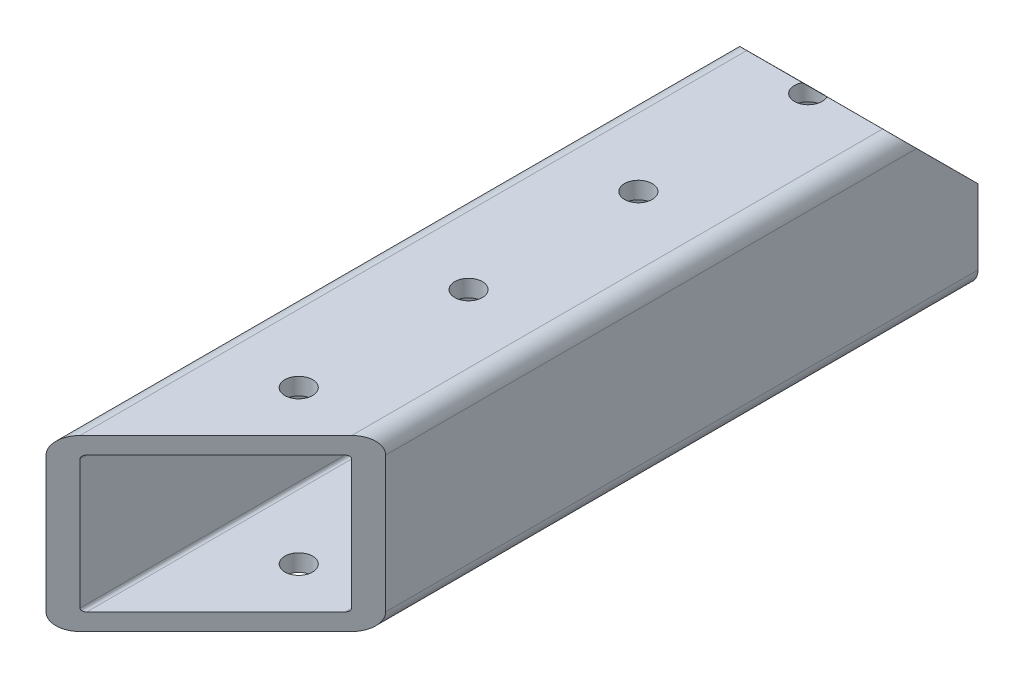
ISO-10303-21;
HEADER;
FILE_DESCRIPTION(('STEP AP214'),'2;1');
FILE_NAME('part.step','',(''),(''),'','','');
FILE_SCHEMA(('AUTOMOTIVE_DESIGN { 1 0 10303 214 1 1 1 1 }'));
ENDSEC;
DATA;
#1=APPLICATION_CONTEXT('core data for automotive mechanical design processes');
#2=APPLICATION_PROTOCOL_DEFINITION('international standard','automotive_design',2000,#1);
#3=PRODUCT_CONTEXT('',#1,'mechanical');
#4=PRODUCT('Part','Part','',(#3));
#5=PRODUCT_RELATED_PRODUCT_CATEGORY('part','',(#4));
#6=PRODUCT_DEFINITION_FORMATION('','',#4);
#7=PRODUCT_DEFINITION_CONTEXT('part definition',#1,'design');
#8=PRODUCT_DEFINITION('design','',#6,#7);
#9=PRODUCT_DEFINITION_SHAPE('','',#8);
#10=(LENGTH_UNIT() NAMED_UNIT(*) SI_UNIT(.MILLI.,.METRE.));
#11=(NAMED_UNIT(*) PLANE_ANGLE_UNIT() SI_UNIT($,.RADIAN.));
#12=(NAMED_UNIT(*) SI_UNIT($,.STERADIAN.) SOLID_ANGLE_UNIT());
#13=UNCERTAINTY_MEASURE_WITH_UNIT(LENGTH_MEASURE(1.E-05),#10,'distance_accuracy_value','');
#14=(GEOMETRIC_REPRESENTATION_CONTEXT(3) GLOBAL_UNCERTAINTY_ASSIGNED_CONTEXT((#13)) GLOBAL_UNIT_ASSIGNED_CONTEXT((#10,
#11,#12)) REPRESENTATION_CONTEXT('',''));
#15=CARTESIAN_POINT('',(0.,0.,0.));
#16=DIRECTION('',(0.,0.,1.));
#17=DIRECTION('',(1.,0.,0.));
#18=AXIS2_PLACEMENT_3D('',#15,#16,#17);
#19=CARTESIAN_POINT('',(0.,-12.7,-711.2));
#20=DIRECTION('',(0.,1.,0.));
#21=DIRECTION('',(0.,0.,1.));
#22=AXIS2_PLACEMENT_3D('',#19,#20,#21);
#23=CYLINDRICAL_SURFACE('',#22,2.07009999999996);
#24=CARTESIAN_POINT('',(0.,10.16,-711.2));
#25=DIRECTION('',(0.,1.,0.));
#26=DIRECTION('',(0.,0.,1.));
#27=AXIS2_PLACEMENT_3D('',#24,#25,#26);
#28=CIRCLE('',#27,2.07009999999996);
#29=CARTESIAN_POINT('',(0.,10.16,-709.1299));
#30=VERTEX_POINT('',#29);
#31=EDGE_CURVE('E215',#30,#30,#28,.T.);
#32=ORIENTED_EDGE('',*,*,#31,.F.);
#33=EDGE_LOOP('',(#32));
#34=FACE_BOUND('',#33,.T.);
#35=CARTESIAN_POINT('',(0.,12.7,-711.2));
#36=DIRECTION('',(0.,1.,0.));
#37=DIRECTION('',(0.,0.,1.));
#38=AXIS2_PLACEMENT_3D('',#35,#36,#37);
#39=CIRCLE('',#38,2.07009999999996);
#40=CARTESIAN_POINT('',(0.,12.7,-709.1299));
#41=VERTEX_POINT('',#40);
#42=EDGE_CURVE('E310',#41,#41,#39,.T.);
#43=ORIENTED_EDGE('',*,*,#42,.T.);
#44=EDGE_LOOP('',(#43));
#45=FACE_BOUND('',#44,.T.);
#46=ADVANCED_FACE('F35',(#34,#45),#23,.F.);
#47=CARTESIAN_POINT('',(0.,-12.7,-736.6));
#48=DIRECTION('',(0.,1.,0.));
#49=DIRECTION('',(0.,0.,1.));
#50=AXIS2_PLACEMENT_3D('',#47,#48,#49);
#51=CYLINDRICAL_SURFACE('',#50,2.07009999999996);
#52=CARTESIAN_POINT('',(0.,10.16,-736.6));
#53=DIRECTION('',(0.,1.,0.));
#54=DIRECTION('',(0.,0.,1.));
#55=AXIS2_PLACEMENT_3D('',#52,#53,#54);
#56=CIRCLE('',#55,2.07009999999996);
#57=CARTESIAN_POINT('',(0.,10.16,-734.5299));
#58=VERTEX_POINT('',#57);
#59=EDGE_CURVE('E276',#58,#58,#56,.T.);
#60=ORIENTED_EDGE('',*,*,#59,.F.);
#61=EDGE_LOOP('',(#60));
#62=FACE_BOUND('',#61,.T.);
#63=CARTESIAN_POINT('',(0.,12.7,-736.6));
#64=DIRECTION('',(0.,1.,0.));
#65=DIRECTION('',(0.,0.,1.));
#66=AXIS2_PLACEMENT_3D('',#63,#64,#65);
#67=CIRCLE('',#66,2.07009999999996);
#68=CARTESIAN_POINT('',(-1.8276061883527,12.7,-737.572198349255));
#69=VERTEX_POINT('',#68);
#70=CARTESIAN_POINT('',(1.8276061883527,12.7,-737.572198349255));
#71=VERTEX_POINT('',#70);
#72=EDGE_CURVE('E307',#69,#71,#67,.T.);
#73=ORIENTED_EDGE('',*,*,#72,.T.);
#74=CARTESIAN_POINT('',(0.,13.6691541004868,-736.6));
#75=DIRECTION('',(0.,-0.708214729691191,0.705997093937668));
#76=DIRECTION('',(0.,0.705997093937668,0.708214729691191));
#77=AXIS2_PLACEMENT_3D('',#74,#75,#76);
#78=ELLIPSE('',#77,2.92298354328582,2.07009999999996);
#79=EDGE_CURVE('E427',#71,#69,#78,.F.);
#80=ORIENTED_EDGE('',*,*,#79,.T.);
#81=EDGE_LOOP('',(#73,#80));
#82=FACE_BOUND('',#81,.T.);
#83=ADVANCED_FACE('F445',(#62,#82),#51,.F.);
#84=CARTESIAN_POINT('',(-9.65999999999999,9.66,749.3));
#85=DIRECTION('',(0.,0.,1.));
#86=DIRECTION('',(1.,0.,0.));
#87=AXIS2_PLACEMENT_3D('',#84,#85,#86);
#88=CYLINDRICAL_SURFACE('',#87,0.5);
#89=DIRECTION('',(0.,0.,-1.));
#90=VECTOR('',#89,1.);
#91=CARTESIAN_POINT('',(-10.16,9.66,749.3));
#92=LINE('',#91,#90);
#93=CARTESIAN_POINT('',(-10.16,9.66,-740.621747415036));
#94=VERTEX_POINT('',#93);
#95=CARTESIAN_POINT('',(-10.16,9.66,-637.837524484275));
#96=VERTEX_POINT('',#95);
#97=EDGE_CURVE('E57',#94,#96,#92,.F.);
#98=ORIENTED_EDGE('',*,*,#97,.F.);
#99=CARTESIAN_POINT('',(-9.65999999999999,9.66,-740.621747415036));
#100=DIRECTION('',(0.,-0.708214729691191,0.705997093937668));
#101=DIRECTION('',(0.,0.705997093937669,0.708214729691191));
#102=AXIS2_PLACEMENT_3D('',#99,#100,#101);
#103=ELLIPSE('',#102,0.708218212643443,0.5);
#104=CARTESIAN_POINT('',(-9.66000000000005,10.16,-740.120176845006));
#105=VERTEX_POINT('',#104);
#106=EDGE_CURVE('E421',#94,#105,#103,.F.);
#107=ORIENTED_EDGE('',*,*,#106,.T.);
#108=DIRECTION('',(0.,0.,-1.));
#109=VECTOR('',#108,1.);
#110=CARTESIAN_POINT('',(-9.65999999999999,10.16,749.3));
#111=LINE('',#110,#109);
#112=CARTESIAN_POINT('',(-9.66000000000005,10.16,-638.337524484275));
#113=VERTEX_POINT('',#112);
#114=EDGE_CURVE('E269',#113,#105,#111,.T.);
#115=ORIENTED_EDGE('',*,*,#114,.F.);
#116=CARTESIAN_POINT('',(-9.65999999999999,9.66,-638.337524484276));
#117=DIRECTION('',(-0.707106781186566,0.,-0.707106781186529));
#118=DIRECTION('',(-0.707106781186529,0.,0.707106781186566));
#119=AXIS2_PLACEMENT_3D('',#116,#117,#118);
#120=ELLIPSE('',#119,0.707106781186567,0.5);
#121=EDGE_CURVE('E322',#113,#96,#120,.F.);
#122=ORIENTED_EDGE('',*,*,#121,.T.);
#123=EDGE_LOOP('',(#98,#107,#115,#122));
#124=FACE_BOUND('',#123,.T.);
#125=ADVANCED_FACE('F633',(#124),#88,.F.);
#126=CARTESIAN_POINT('',(0.,-12.7,-685.8));
#127=DIRECTION('',(0.,1.,0.));
#128=DIRECTION('',(0.,0.,1.));
#129=AXIS2_PLACEMENT_3D('',#126,#127,#128);
#130=CYLINDRICAL_SURFACE('',#129,2.07009999999996);
#131=CARTESIAN_POINT('',(0.,10.16,-685.8));
#132=DIRECTION('',(0.,1.,0.));
#133=DIRECTION('',(0.,0.,1.));
#134=AXIS2_PLACEMENT_3D('',#131,#132,#133);
#135=CIRCLE('',#134,2.07009999999996);
#136=CARTESIAN_POINT('',(0.,10.16,-683.7299));
#137=VERTEX_POINT('',#136);
#138=EDGE_CURVE('E266',#137,#137,#135,.T.);
#139=ORIENTED_EDGE('',*,*,#138,.F.);
#140=EDGE_LOOP('',(#139));
#141=FACE_BOUND('',#140,.T.);
#142=CARTESIAN_POINT('',(0.,12.7,-685.8));
#143=DIRECTION('',(0.,1.,0.));
#144=DIRECTION('',(0.,0.,1.));
#145=AXIS2_PLACEMENT_3D('',#142,#143,#144);
#146=CIRCLE('',#145,2.07009999999996);
#147=CARTESIAN_POINT('',(0.,12.7,-683.7299));
#148=VERTEX_POINT('',#147);
#149=EDGE_CURVE('E304',#148,#148,#146,.T.);
#150=ORIENTED_EDGE('',*,*,#149,.T.);
#151=EDGE_LOOP('',(#150));
#152=FACE_BOUND('',#151,.T.);
#153=ADVANCED_FACE('F625',(#141,#152),#130,.F.);
#154=CARTESIAN_POINT('',(0.,-12.7,-660.4));
#155=DIRECTION('',(0.,1.,0.));
#156=DIRECTION('',(0.,0.,1.));
#157=AXIS2_PLACEMENT_3D('',#154,#155,#156);
#158=CYLINDRICAL_SURFACE('',#157,2.07009999999996);
#159=CARTESIAN_POINT('',(0.,10.16,-660.4));
#160=DIRECTION('',(0.,1.,0.));
#161=DIRECTION('',(0.,0.,1.));
#162=AXIS2_PLACEMENT_3D('',#159,#160,#161);
#163=CIRCLE('',#162,2.07009999999996);
#164=CARTESIAN_POINT('',(0.,10.16,-658.3299));
#165=VERTEX_POINT('',#164);
#166=EDGE_CURVE('E207',#165,#165,#163,.T.);
#167=ORIENTED_EDGE('',*,*,#166,.F.);
#168=EDGE_LOOP('',(#167));
#169=FACE_BOUND('',#168,.T.);
#170=CARTESIAN_POINT('',(0.,12.7,-660.4));
#171=DIRECTION('',(0.,1.,0.));
#172=DIRECTION('',(0.,0.,1.));
#173=AXIS2_PLACEMENT_3D('',#170,#171,#172);
#174=CIRCLE('',#173,2.07009999999996);
#175=CARTESIAN_POINT('',(0.,12.7,-658.3299));
#176=VERTEX_POINT('',#175);
#177=EDGE_CURVE('E301',#176,#176,#174,.T.);
#178=ORIENTED_EDGE('',*,*,#177,.T.);
#179=EDGE_LOOP('',(#178));
#180=FACE_BOUND('',#179,.T.);
#181=ADVANCED_FACE('F618',(#169,#180),#158,.F.);
#182=CARTESIAN_POINT('',(9.66,9.65999999999999,749.3));
#183=DIRECTION('',(0.,0.,1.));
#184=DIRECTION('',(1.,0.,0.));
#185=AXIS2_PLACEMENT_3D('',#182,#183,#184);
#186=CYLINDRICAL_SURFACE('',#185,0.5);
#187=DIRECTION('',(0.,0.,-1.));
#188=VECTOR('',#187,1.);
#189=CARTESIAN_POINT('',(9.66,10.16,749.3));
#190=LINE('',#189,#188);
#191=CARTESIAN_POINT('',(9.66,10.16,-740.120176845006));
#192=VERTEX_POINT('',#191);
#193=CARTESIAN_POINT('',(9.66,10.16,-657.657524484276));
#194=VERTEX_POINT('',#193);
#195=EDGE_CURVE('E273',#192,#194,#190,.F.);
#196=ORIENTED_EDGE('',*,*,#195,.F.);
#197=CARTESIAN_POINT('',(9.66,9.65999999999999,-740.621747415036));
#198=DIRECTION('',(0.,-0.708214729691191,0.705997093937668));
#199=DIRECTION('',(0.,0.705997093937669,0.708214729691191));
#200=AXIS2_PLACEMENT_3D('',#197,#198,#199);
#201=ELLIPSE('',#200,0.708218212643443,0.5);
#202=CARTESIAN_POINT('',(10.16,9.66,-740.621747415036));
#203=VERTEX_POINT('',#202);
#204=EDGE_CURVE('E417',#192,#203,#201,.F.);
#205=ORIENTED_EDGE('',*,*,#204,.T.);
#206=DIRECTION('',(0.,0.,1.));
#207=VECTOR('',#206,1.);
#208=CARTESIAN_POINT('',(10.16,9.65999999999999,749.3));
#209=LINE('',#208,#207);
#210=CARTESIAN_POINT('',(10.16,9.65999999999999,-658.157524484277));
#211=VERTEX_POINT('',#210);
#212=EDGE_CURVE('E202',#211,#203,#209,.F.);
#213=ORIENTED_EDGE('',*,*,#212,.F.);
#214=CARTESIAN_POINT('',(9.66,9.65999999999999,-657.657524484276));
#215=DIRECTION('',(-0.707106781186566,0.,-0.707106781186529));
#216=DIRECTION('',(-0.707106781186529,0.,0.707106781186566));
#217=AXIS2_PLACEMENT_3D('',#214,#215,#216);
#218=ELLIPSE('',#217,0.707106781186567,0.5);
#219=EDGE_CURVE('E327',#211,#194,#218,.F.);
#220=ORIENTED_EDGE('',*,*,#219,.T.);
#221=EDGE_LOOP('',(#196,#205,#213,#220));
#222=FACE_BOUND('',#221,.T.);
#223=ADVANCED_FACE('F390',(#222),#186,.F.);
#224=CARTESIAN_POINT('',(0.,-12.7,-711.2));
#225=DIRECTION('',(0.,1.,0.));
#226=DIRECTION('',(0.,0.,1.));
#227=AXIS2_PLACEMENT_3D('',#224,#225,#226);
#228=CYLINDRICAL_SURFACE('',#227,2.07009999999996);
#229=CARTESIAN_POINT('',(0.,-10.16,-711.2));
#230=DIRECTION('',(0.,1.,0.));
#231=DIRECTION('',(0.,0.,1.));
#232=AXIS2_PLACEMENT_3D('',#229,#230,#231);
#233=CIRCLE('',#232,2.07009999999996);
#234=CARTESIAN_POINT('',(0.,-10.16,-709.1299));
#235=VERTEX_POINT('',#234);
#236=EDGE_CURVE('E211',#235,#235,#233,.F.);
#237=ORIENTED_EDGE('',*,*,#236,.F.);
#238=EDGE_LOOP('',(#237));
#239=FACE_BOUND('',#238,.T.);
#240=CARTESIAN_POINT('',(0.,-12.7,-711.2));
#241=DIRECTION('',(0.,1.,0.));
#242=DIRECTION('',(0.,0.,1.));
#243=AXIS2_PLACEMENT_3D('',#240,#241,#242);
#244=CIRCLE('',#243,2.07009999999996);
#245=CARTESIAN_POINT('',(0.,-12.7,-709.1299));
#246=VERTEX_POINT('',#245);
#247=EDGE_CURVE('E223',#246,#246,#244,.F.);
#248=ORIENTED_EDGE('',*,*,#247,.T.);
#249=EDGE_LOOP('',(#248));
#250=FACE_BOUND('',#249,.T.);
#251=ADVANCED_FACE('F603',(#239,#250),#228,.F.);
#252=CARTESIAN_POINT('',(0.,-12.7,-736.6));
#253=DIRECTION('',(0.,1.,0.));
#254=DIRECTION('',(0.,0.,1.));
#255=AXIS2_PLACEMENT_3D('',#252,#253,#254);
#256=CYLINDRICAL_SURFACE('',#255,2.07009999999996);
#257=CARTESIAN_POINT('',(0.,-10.16,-736.6));
#258=DIRECTION('',(0.,1.,0.));
#259=DIRECTION('',(0.,0.,1.));
#260=AXIS2_PLACEMENT_3D('',#257,#258,#259);
#261=CIRCLE('',#260,2.07009999999996);
#262=CARTESIAN_POINT('',(0.,-10.16,-734.5299));
#263=VERTEX_POINT('',#262);
#264=EDGE_CURVE('E258',#263,#263,#261,.F.);
#265=ORIENTED_EDGE('',*,*,#264,.F.);
#266=EDGE_LOOP('',(#265));
#267=FACE_BOUND('',#266,.T.);
#268=CARTESIAN_POINT('',(0.,-12.7,-736.6));
#269=DIRECTION('',(0.,1.,0.));
#270=DIRECTION('',(0.,0.,1.));
#271=AXIS2_PLACEMENT_3D('',#268,#269,#270);
#272=CIRCLE('',#271,2.07009999999996);
#273=CARTESIAN_POINT('',(0.,-12.7,-734.5299));
#274=VERTEX_POINT('',#273);
#275=EDGE_CURVE('E293',#274,#274,#272,.F.);
#276=ORIENTED_EDGE('',*,*,#275,.T.);
#277=EDGE_LOOP('',(#276));
#278=FACE_BOUND('',#277,.T.);
#279=ADVANCED_FACE('F597',(#267,#278),#256,.F.);
#280=CARTESIAN_POINT('',(-9.65999999999999,-9.66,749.3));
#281=DIRECTION('',(0.,0.,1.));
#282=DIRECTION('',(1.,0.,0.));
#283=AXIS2_PLACEMENT_3D('',#280,#281,#282);
#284=CYLINDRICAL_SURFACE('',#283,0.5);
#285=DIRECTION('',(0.,0.,-1.));
#286=VECTOR('',#285,1.);
#287=CARTESIAN_POINT('',(-10.16,-9.66,749.3));
#288=LINE('',#287,#286);
#289=CARTESIAN_POINT('',(-10.16,-9.66,-637.837524484275));
#290=VERTEX_POINT('',#289);
#291=CARTESIAN_POINT('',(-10.16,-9.66,-749.3));
#292=VERTEX_POINT('',#291);
#293=EDGE_CURVE('E212',#290,#292,#288,.T.);
#294=ORIENTED_EDGE('',*,*,#293,.F.);
#295=CARTESIAN_POINT('',(-9.65999999999999,-9.66,-638.337524484276));
#296=DIRECTION('',(-0.707106781186566,0.,-0.707106781186529));
#297=DIRECTION('',(-0.707106781186529,0.,0.707106781186566));
#298=AXIS2_PLACEMENT_3D('',#295,#296,#297);
#299=ELLIPSE('',#298,0.707106781186567,0.5);
#300=CARTESIAN_POINT('',(-9.66000000000011,-10.16,-638.337524484275));
#301=VERTEX_POINT('',#300);
#302=EDGE_CURVE('E378',#290,#301,#299,.F.);
#303=ORIENTED_EDGE('',*,*,#302,.T.);
#304=DIRECTION('',(0.,0.,1.));
#305=VECTOR('',#304,1.);
#306=CARTESIAN_POINT('',(-9.65999999999999,-10.16,749.3));
#307=LINE('',#306,#305);
#308=CARTESIAN_POINT('',(-9.65999999999999,-10.16,-749.3));
#309=VERTEX_POINT('',#308);
#310=EDGE_CURVE('E256',#309,#301,#307,.T.);
#311=ORIENTED_EDGE('',*,*,#310,.F.);
#312=CARTESIAN_POINT('',(-9.65999999999999,-9.66,-749.3));
#313=DIRECTION('',(0.,0.,1.));
#314=DIRECTION('',(1.,0.,0.));
#315=AXIS2_PLACEMENT_3D('',#312,#313,#314);
#316=CIRCLE('',#315,0.5);
#317=EDGE_CURVE('E315',#292,#309,#316,.T.);
#318=ORIENTED_EDGE('',*,*,#317,.F.);
#319=EDGE_LOOP('',(#294,#303,#311,#318));
#320=FACE_BOUND('',#319,.T.);
#321=ADVANCED_FACE('F407',(#320),#284,.F.);
#322=CARTESIAN_POINT('',(9.66,-9.66,749.3));
#323=DIRECTION('',(0.,0.,1.));
#324=DIRECTION('',(1.,0.,0.));
#325=AXIS2_PLACEMENT_3D('',#322,#323,#324);
#326=CYLINDRICAL_SURFACE('',#325,0.5);
#327=DIRECTION('',(0.,0.,1.));
#328=VECTOR('',#327,1.);
#329=CARTESIAN_POINT('',(9.66,-10.16,749.3));
#330=LINE('',#329,#328);
#331=CARTESIAN_POINT('',(9.66,-10.16,-657.657524484276));
#332=VERTEX_POINT('',#331);
#333=CARTESIAN_POINT('',(9.66,-10.16,-749.3));
#334=VERTEX_POINT('',#333);
#335=EDGE_CURVE('E253',#332,#334,#330,.F.);
#336=ORIENTED_EDGE('',*,*,#335,.F.);
#337=CARTESIAN_POINT('',(9.66,-9.66,-657.657524484276));
#338=DIRECTION('',(-0.707106781186566,0.,-0.707106781186529));
#339=DIRECTION('',(-0.707106781186529,0.,0.707106781186566));
#340=AXIS2_PLACEMENT_3D('',#337,#338,#339);
#341=ELLIPSE('',#340,0.707106781186567,0.5);
#342=CARTESIAN_POINT('',(10.16,-9.66,-658.157524484277));
#343=VERTEX_POINT('',#342);
#344=EDGE_CURVE('E376',#332,#343,#341,.F.);
#345=ORIENTED_EDGE('',*,*,#344,.T.);
#346=DIRECTION('',(0.,0.,1.));
#347=VECTOR('',#346,1.);
#348=CARTESIAN_POINT('',(10.16,-9.66,749.3));
#349=LINE('',#348,#347);
#350=CARTESIAN_POINT('',(10.16,-9.66,-749.3));
#351=VERTEX_POINT('',#350);
#352=EDGE_CURVE('E206',#351,#343,#349,.T.);
#353=ORIENTED_EDGE('',*,*,#352,.F.);
#354=CARTESIAN_POINT('',(9.66,-9.66,-749.3));
#355=DIRECTION('',(0.,0.,1.));
#356=DIRECTION('',(1.,0.,0.));
#357=AXIS2_PLACEMENT_3D('',#354,#355,#356);
#358=CIRCLE('',#357,0.5);
#359=EDGE_CURVE('E314',#334,#351,#358,.T.);
#360=ORIENTED_EDGE('',*,*,#359,.F.);
#361=EDGE_LOOP('',(#336,#345,#353,#360));
#362=FACE_BOUND('',#361,.T.);
#363=ADVANCED_FACE('F400',(#362),#326,.F.);
#364=CARTESIAN_POINT('',(0.,-12.7,-685.8));
#365=DIRECTION('',(0.,1.,0.));
#366=DIRECTION('',(0.,0.,1.));
#367=AXIS2_PLACEMENT_3D('',#364,#365,#366);
#368=CYLINDRICAL_SURFACE('',#367,2.07009999999996);
#369=CARTESIAN_POINT('',(0.,-10.16,-685.8));
#370=DIRECTION('',(0.,1.,0.));
#371=DIRECTION('',(0.,0.,1.));
#372=AXIS2_PLACEMENT_3D('',#369,#370,#371);
#373=CIRCLE('',#372,2.07009999999996);
#374=CARTESIAN_POINT('',(0.,-10.16,-683.7299));
#375=VERTEX_POINT('',#374);
#376=EDGE_CURVE('E250',#375,#375,#373,.F.);
#377=ORIENTED_EDGE('',*,*,#376,.F.);
#378=EDGE_LOOP('',(#377));
#379=FACE_BOUND('',#378,.T.);
#380=CARTESIAN_POINT('',(0.,-12.7,-685.8));
#381=DIRECTION('',(0.,1.,0.));
#382=DIRECTION('',(0.,0.,1.));
#383=AXIS2_PLACEMENT_3D('',#380,#381,#382);
#384=CIRCLE('',#383,2.07009999999996);
#385=CARTESIAN_POINT('',(0.,-12.7,-683.7299));
#386=VERTEX_POINT('',#385);
#387=EDGE_CURVE('E285',#386,#386,#384,.F.);
#388=ORIENTED_EDGE('',*,*,#387,.T.);
#389=EDGE_LOOP('',(#388));
#390=FACE_BOUND('',#389,.T.);
#391=ADVANCED_FACE('F573',(#379,#390),#368,.F.);
#392=CARTESIAN_POINT('',(0.,-12.7,-660.4));
#393=DIRECTION('',(0.,1.,0.));
#394=DIRECTION('',(0.,0.,1.));
#395=AXIS2_PLACEMENT_3D('',#392,#393,#394);
#396=CYLINDRICAL_SURFACE('',#395,2.07009999999996);
#397=CARTESIAN_POINT('',(0.,-10.16,-660.4));
#398=DIRECTION('',(0.,1.,0.));
#399=DIRECTION('',(0.,0.,1.));
#400=AXIS2_PLACEMENT_3D('',#397,#398,#399);
#401=CIRCLE('',#400,2.07009999999996);
#402=CARTESIAN_POINT('',(0.,-10.16,-658.3299));
#403=VERTEX_POINT('',#402);
#404=EDGE_CURVE('E246',#403,#403,#401,.F.);
#405=ORIENTED_EDGE('',*,*,#404,.F.);
#406=EDGE_LOOP('',(#405));
#407=FACE_BOUND('',#406,.T.);
#408=CARTESIAN_POINT('',(0.,-12.7,-660.4));
#409=DIRECTION('',(0.,1.,0.));
#410=DIRECTION('',(0.,0.,1.));
#411=AXIS2_PLACEMENT_3D('',#408,#409,#410);
#412=CIRCLE('',#411,2.07009999999996);
#413=CARTESIAN_POINT('',(0.,-12.7,-658.3299));
#414=VERTEX_POINT('',#413);
#415=EDGE_CURVE('E218',#414,#414,#412,.F.);
#416=ORIENTED_EDGE('',*,*,#415,.T.);
#417=EDGE_LOOP('',(#416));
#418=FACE_BOUND('',#417,.T.);
#419=ADVANCED_FACE('F563',(#407,#418),#396,.F.);
#420=CARTESIAN_POINT('',(-10.16,12.7,749.3));
#421=DIRECTION('',(0.,-1.,0.));
#422=DIRECTION('',(0.,0.,-1.));
#423=AXIS2_PLACEMENT_3D('',#420,#421,#422);
#424=PLANE('',#423);
#425=ORIENTED_EDGE('',*,*,#177,.F.);
#426=EDGE_LOOP('',(#425));
#427=FACE_BOUND('',#426,.T.);
#428=ORIENTED_EDGE('',*,*,#149,.F.);
#429=EDGE_LOOP('',(#428));
#430=FACE_BOUND('',#429,.T.);
#431=DIRECTION('',(0.,0.,-1.));
#432=VECTOR('',#431,1.);
#433=CARTESIAN_POINT('',(10.16,12.7,749.3));
#434=LINE('',#433,#432);
#435=CARTESIAN_POINT('',(10.16,12.7,-737.572198349255));
#436=VERTEX_POINT('',#435);
#437=CARTESIAN_POINT('',(10.16,12.7,-658.157524484277));
#438=VERTEX_POINT('',#437);
#439=EDGE_CURVE('E240',#436,#438,#434,.F.);
#440=ORIENTED_EDGE('',*,*,#439,.F.);
#441=DIRECTION('',(-1.,0.,0.));
#442=VECTOR('',#441,1.);
#443=CARTESIAN_POINT('',(12.7,12.7,-737.572198349255));
#444=LINE('',#443,#442);
#445=EDGE_CURVE('E415',#436,#71,#444,.T.);
#446=ORIENTED_EDGE('',*,*,#445,.T.);
#447=ORIENTED_EDGE('',*,*,#72,.F.);
#448=CARTESIAN_POINT('',(-10.16,12.7,-737.572198349255));
#449=VERTEX_POINT('',#448);
#450=EDGE_CURVE('E183',#69,#449,#444,.T.);
#451=ORIENTED_EDGE('',*,*,#450,.T.);
#452=DIRECTION('',(0.,0.,-1.));
#453=VECTOR('',#452,1.);
#454=CARTESIAN_POINT('',(-10.16,12.7,749.3));
#455=LINE('',#454,#453);
#456=CARTESIAN_POINT('',(-10.16,12.7,-637.837524484275));
#457=VERTEX_POINT('',#456);
#458=EDGE_CURVE('E227',#457,#449,#455,.T.);
#459=ORIENTED_EDGE('',*,*,#458,.F.);
#460=DIRECTION('',(0.707106781186529,0.,-0.707106781186566));
#461=VECTOR('',#460,1.);
#462=CARTESIAN_POINT('',(-703.728762242138,12.7,55.7312377578993));
#463=LINE('',#462,#461);
#464=EDGE_CURVE('E369',#457,#438,#463,.T.);
#465=ORIENTED_EDGE('',*,*,#464,.T.);
#466=EDGE_LOOP('',(#440,#446,#447,#451,#459,#465));
#467=FACE_BOUND('',#466,.T.);
#468=ORIENTED_EDGE('',*,*,#42,.F.);
#469=EDGE_LOOP('',(#468));
#470=FACE_BOUND('',#469,.T.);
#471=ADVANCED_FACE('F436',(#427,#430,#467,#470),#424,.F.);
#472=CARTESIAN_POINT('',(-10.16,10.16,749.3));
#473=DIRECTION('',(0.,0.,-1.));
#474=DIRECTION('',(-1.,0.,0.));
#475=AXIS2_PLACEMENT_3D('',#472,#473,#474);
#476=CYLINDRICAL_SURFACE('',#475,2.54);
#477=CARTESIAN_POINT('',(-10.16,10.16,-740.120176845006));
#478=DIRECTION('',(0.,-0.708214729691191,0.705997093937668));
#479=DIRECTION('',(0.,-0.705997093937669,-0.708214729691191));
#480=AXIS2_PLACEMENT_3D('',#477,#478,#479);
#481=ELLIPSE('',#480,3.59774852022869,2.54);
#482=CARTESIAN_POINT('',(-12.7,10.16,-740.120176845006));
#483=VERTEX_POINT('',#482);
#484=EDGE_CURVE('E425',#483,#449,#481,.F.);
#485=ORIENTED_EDGE('',*,*,#484,.F.);
#486=DIRECTION('',(0.,0.,-1.));
#487=VECTOR('',#486,1.);
#488=CARTESIAN_POINT('',(-12.7,10.16,749.3));
#489=LINE('',#488,#487);
#490=CARTESIAN_POINT('',(-12.7,10.16,-635.297524484275));
#491=VERTEX_POINT('',#490);
#492=EDGE_CURVE('E224',#483,#491,#489,.F.);
#493=ORIENTED_EDGE('',*,*,#492,.T.);
#494=CARTESIAN_POINT('',(-10.16,10.16,-637.837524484275));
#495=DIRECTION('',(-0.707106781186566,0.,-0.707106781186529));
#496=DIRECTION('',(0.707106781186529,0.,-0.707106781186566));
#497=AXIS2_PLACEMENT_3D('',#494,#495,#496);
#498=ELLIPSE('',#497,3.59210244842776,2.54);
#499=EDGE_CURVE('E366',#457,#491,#498,.F.);
#500=ORIENTED_EDGE('',*,*,#499,.F.);
#501=ORIENTED_EDGE('',*,*,#458,.T.);
#502=EDGE_LOOP('',(#485,#493,#500,#501));
#503=FACE_BOUND('',#502,.T.);
#504=ADVANCED_FACE('F443',(#503),#476,.T.);
#505=CARTESIAN_POINT('',(-12.7,-10.16,749.3));
#506=DIRECTION('',(1.,0.,0.));
#507=DIRECTION('',(0.,0.,-1.));
#508=AXIS2_PLACEMENT_3D('',#505,#506,#507);
#509=PLANE('',#508);
#510=ORIENTED_EDGE('',*,*,#492,.F.);
#511=DIRECTION('',(0.,0.705997093937669,0.708214729691191));
#512=VECTOR('',#511,1.);
#513=CARTESIAN_POINT('',(-12.7,1.00892166375388,-749.3));
#514=LINE('',#513,#512);
#515=CARTESIAN_POINT('',(-12.7,1.00892166375388,-749.3));
#516=VERTEX_POINT('',#515);
#517=EDGE_CURVE('E173',#516,#483,#514,.T.);
#518=ORIENTED_EDGE('',*,*,#517,.F.);
#519=DIRECTION('',(0.,1.,0.));
#520=VECTOR('',#519,1.);
#521=CARTESIAN_POINT('',(-12.7,-10.16,-749.3));
#522=LINE('',#521,#520);
#523=CARTESIAN_POINT('',(-12.7,-10.16,-749.3));
#524=VERTEX_POINT('',#523);
#525=EDGE_CURVE('E239',#516,#524,#522,.F.);
#526=ORIENTED_EDGE('',*,*,#525,.T.);
#527=DIRECTION('',(0.,0.,-1.));
#528=VECTOR('',#527,1.);
#529=CARTESIAN_POINT('',(-12.7,-10.16,749.3));
#530=LINE('',#529,#528);
#531=CARTESIAN_POINT('',(-12.7,-10.16,-635.297524484275));
#532=VERTEX_POINT('',#531);
#533=EDGE_CURVE('E219',#532,#524,#530,.T.);
#534=ORIENTED_EDGE('',*,*,#533,.F.);
#535=DIRECTION('',(0.,1.,0.));
#536=VECTOR('',#535,1.);
#537=CARTESIAN_POINT('',(-12.7,-10.1600000000002,-635.297524484275));
#538=LINE('',#537,#536);
#539=EDGE_CURVE('E357',#532,#491,#538,.T.);
#540=ORIENTED_EDGE('',*,*,#539,.T.);
#541=EDGE_LOOP('',(#510,#518,#526,#534,#540));
#542=FACE_BOUND('',#541,.T.);
#543=ADVANCED_FACE('F338',(#542),#509,.F.);
#544=CARTESIAN_POINT('',(-10.16,-10.16,749.3));
#545=DIRECTION('',(0.,0.,-1.));
#546=DIRECTION('',(-1.,0.,0.));
#547=AXIS2_PLACEMENT_3D('',#544,#545,#546);
#548=CYLINDRICAL_SURFACE('',#547,2.54);
#549=CARTESIAN_POINT('',(-10.16,-10.16,-637.837524484275));
#550=DIRECTION('',(-0.707106781186566,0.,-0.707106781186529));
#551=DIRECTION('',(0.707106781186529,0.,-0.707106781186566));
#552=AXIS2_PLACEMENT_3D('',#549,#550,#551);
#553=ELLIPSE('',#552,3.59210244842776,2.54);
#554=CARTESIAN_POINT('',(-10.1599999999999,-12.7,-637.837524484275));
#555=VERTEX_POINT('',#554);
#556=EDGE_CURVE('E345',#532,#555,#553,.F.);
#557=ORIENTED_EDGE('',*,*,#556,.F.);
#558=ORIENTED_EDGE('',*,*,#533,.T.);
#559=CARTESIAN_POINT('',(-10.16,-10.16,-749.3));
#560=DIRECTION('',(0.,0.,-1.));
#561=DIRECTION('',(-1.,0.,0.));
#562=AXIS2_PLACEMENT_3D('',#559,#560,#561);
#563=CIRCLE('',#562,2.54);
#564=CARTESIAN_POINT('',(-10.16,-12.7,-749.3));
#565=VERTEX_POINT('',#564);
#566=EDGE_CURVE('E236',#524,#565,#563,.F.);
#567=ORIENTED_EDGE('',*,*,#566,.T.);
#568=DIRECTION('',(0.,0.,-1.));
#569=VECTOR('',#568,1.);
#570=CARTESIAN_POINT('',(-10.16,-12.7,749.3));
#571=LINE('',#570,#569);
#572=EDGE_CURVE('E289',#565,#555,#571,.F.);
#573=ORIENTED_EDGE('',*,*,#572,.T.);
#574=EDGE_LOOP('',(#557,#558,#567,#573));
#575=FACE_BOUND('',#574,.T.);
#576=ADVANCED_FACE('F344',(#575),#548,.T.);
#577=CARTESIAN_POINT('',(-10.16,-12.7,749.3));
#578=DIRECTION('',(0.,1.,0.));
#579=DIRECTION('',(0.,0.,1.));
#580=AXIS2_PLACEMENT_3D('',#577,#578,#579);
#581=PLANE('',#580);
#582=ORIENTED_EDGE('',*,*,#415,.F.);
#583=EDGE_LOOP('',(#582));
#584=FACE_BOUND('',#583,.T.);
#585=ORIENTED_EDGE('',*,*,#387,.F.);
#586=EDGE_LOOP('',(#585));
#587=FACE_BOUND('',#586,.T.);
#588=DIRECTION('',(0.,0.,-1.));
#589=VECTOR('',#588,1.);
#590=CARTESIAN_POINT('',(10.16,-12.7,749.3));
#591=LINE('',#590,#589);
#592=CARTESIAN_POINT('',(10.16,-12.7,-658.157524484277));
#593=VERTEX_POINT('',#592);
#594=CARTESIAN_POINT('',(10.16,-12.7,-749.3));
#595=VERTEX_POINT('',#594);
#596=EDGE_CURVE('E243',#593,#595,#591,.T.);
#597=ORIENTED_EDGE('',*,*,#596,.F.);
#598=DIRECTION('',(-0.707106781186529,0.,0.707106781186566));
#599=VECTOR('',#598,1.);
#600=CARTESIAN_POINT('',(-703.728762242138,-12.7,55.7312377578993));
#601=LINE('',#600,#599);
#602=EDGE_CURVE('E352',#593,#555,#601,.T.);
#603=ORIENTED_EDGE('',*,*,#602,.T.);
#604=ORIENTED_EDGE('',*,*,#572,.F.);
#605=DIRECTION('',(1.,0.,0.));
#606=VECTOR('',#605,1.);
#607=CARTESIAN_POINT('',(-10.16,-12.7,-749.3));
#608=LINE('',#607,#606);
#609=EDGE_CURVE('E233',#565,#595,#608,.T.);
#610=ORIENTED_EDGE('',*,*,#609,.T.);
#611=EDGE_LOOP('',(#597,#603,#604,#610));
#612=FACE_BOUND('',#611,.T.);
#613=ORIENTED_EDGE('',*,*,#275,.F.);
#614=EDGE_LOOP('',(#613));
#615=FACE_BOUND('',#614,.T.);
#616=ORIENTED_EDGE('',*,*,#247,.F.);
#617=EDGE_LOOP('',(#616));
#618=FACE_BOUND('',#617,.T.);
#619=ADVANCED_FACE('F349',(#584,#587,#612,#615,#618),#581,.F.);
#620=CARTESIAN_POINT('',(-10.16,-10.16,749.3));
#621=DIRECTION('',(1.,0.,0.));
#622=DIRECTION('',(0.,0.,-1.));
#623=AXIS2_PLACEMENT_3D('',#620,#621,#622);
#624=PLANE('',#623);
#625=DIRECTION('',(0.,-0.705997093937669,-0.708214729691191));
#626=VECTOR('',#625,1.);
#627=CARTESIAN_POINT('',(-10.16,744.738289866656,-3.23447368535223));
#628=LINE('',#627,#626);
#629=CARTESIAN_POINT('',(-10.16,1.00892166375388,-749.3));
#630=VERTEX_POINT('',#629);
#631=EDGE_CURVE('E409',#94,#630,#628,.T.);
#632=ORIENTED_EDGE('',*,*,#631,.F.);
#633=ORIENTED_EDGE('',*,*,#97,.T.);
#634=DIRECTION('',(0.,1.,0.));
#635=VECTOR('',#634,1.);
#636=CARTESIAN_POINT('',(-10.16,-10.1600000000002,-637.837524484275));
#637=LINE('',#636,#635);
#638=EDGE_CURVE('E384',#290,#96,#637,.T.);
#639=ORIENTED_EDGE('',*,*,#638,.F.);
#640=ORIENTED_EDGE('',*,*,#293,.T.);
#641=DIRECTION('',(0.,1.,0.));
#642=VECTOR('',#641,1.);
#643=CARTESIAN_POINT('',(-10.16,-10.16,-749.3));
#644=LINE('',#643,#642);
#645=EDGE_CURVE('E232',#292,#630,#644,.T.);
#646=ORIENTED_EDGE('',*,*,#645,.T.);
#647=EDGE_LOOP('',(#632,#633,#639,#640,#646));
#648=FACE_BOUND('',#647,.T.);
#649=ADVANCED_FACE('F408',(#648),#624,.T.);
#650=CARTESIAN_POINT('',(-10.16,10.16,749.3));
#651=DIRECTION('',(0.,-1.,0.));
#652=DIRECTION('',(0.,0.,-1.));
#653=AXIS2_PLACEMENT_3D('',#650,#651,#652);
#654=PLANE('',#653);
#655=DIRECTION('',(-1.,0.,0.));
#656=VECTOR('',#655,1.);
#657=CARTESIAN_POINT('',(-10.16,10.16,-740.120176845006));
#658=LINE('',#657,#656);
#659=EDGE_CURVE('E419',#192,#105,#658,.T.);
#660=ORIENTED_EDGE('',*,*,#659,.F.);
#661=ORIENTED_EDGE('',*,*,#195,.T.);
#662=DIRECTION('',(0.707106781186529,0.,-0.707106781186566));
#663=VECTOR('',#662,1.);
#664=CARTESIAN_POINT('',(-703.728762242138,10.16,55.7312377578993));
#665=LINE('',#664,#663);
#666=EDGE_CURVE('E316',#113,#194,#665,.T.);
#667=ORIENTED_EDGE('',*,*,#666,.F.);
#668=ORIENTED_EDGE('',*,*,#114,.T.);
#669=EDGE_LOOP('',(#660,#661,#667,#668));
#670=FACE_BOUND('',#669,.T.);
#671=ORIENTED_EDGE('',*,*,#166,.T.);
#672=EDGE_LOOP('',(#671));
#673=FACE_BOUND('',#672,.T.);
#674=ORIENTED_EDGE('',*,*,#138,.T.);
#675=EDGE_LOOP('',(#674));
#676=FACE_BOUND('',#675,.T.);
#677=ORIENTED_EDGE('',*,*,#59,.T.);
#678=EDGE_LOOP('',(#677));
#679=FACE_BOUND('',#678,.T.);
#680=ORIENTED_EDGE('',*,*,#31,.T.);
#681=EDGE_LOOP('',(#680));
#682=FACE_BOUND('',#681,.T.);
#683=ADVANCED_FACE('F508',(#670,#673,#676,#679,#682),#654,.T.);
#684=CARTESIAN_POINT('',(10.16,-10.16,749.3));
#685=DIRECTION('',(-1.,0.,0.));
#686=DIRECTION('',(0.,0.,1.));
#687=AXIS2_PLACEMENT_3D('',#684,#685,#686);
#688=PLANE('',#687);
#689=DIRECTION('',(0.,0.705997093937669,0.708214729691191));
#690=VECTOR('',#689,1.);
#691=CARTESIAN_POINT('',(10.16,744.738289866656,-3.23447368535223));
#692=LINE('',#691,#690);
#693=CARTESIAN_POINT('',(10.16,1.00892166375388,-749.3));
#694=VERTEX_POINT('',#693);
#695=EDGE_CURVE('E414',#694,#203,#692,.T.);
#696=ORIENTED_EDGE('',*,*,#695,.F.);
#697=DIRECTION('',(0.,1.,0.));
#698=VECTOR('',#697,1.);
#699=CARTESIAN_POINT('',(10.16,-10.16,-749.3));
#700=LINE('',#699,#698);
#701=EDGE_CURVE('E182',#694,#351,#700,.F.);
#702=ORIENTED_EDGE('',*,*,#701,.T.);
#703=ORIENTED_EDGE('',*,*,#352,.T.);
#704=DIRECTION('',(0.,-1.,0.));
#705=VECTOR('',#704,1.);
#706=CARTESIAN_POINT('',(10.16,-10.1600000000002,-658.157524484277));
#707=LINE('',#706,#705);
#708=EDGE_CURVE('E381',#211,#343,#707,.T.);
#709=ORIENTED_EDGE('',*,*,#708,.F.);
#710=ORIENTED_EDGE('',*,*,#212,.T.);
#711=EDGE_LOOP('',(#696,#702,#703,#709,#710));
#712=FACE_BOUND('',#711,.T.);
#713=ADVANCED_FACE('F395',(#712),#688,.T.);
#714=CARTESIAN_POINT('',(-10.16,-10.16,749.3));
#715=DIRECTION('',(0.,1.,0.));
#716=DIRECTION('',(0.,0.,1.));
#717=AXIS2_PLACEMENT_3D('',#714,#715,#716);
#718=PLANE('',#717);
#719=DIRECTION('',(-0.707106781186529,0.,0.707106781186566));
#720=VECTOR('',#719,1.);
#721=CARTESIAN_POINT('',(-703.728762242138,-10.16,55.7312377578993));
#722=LINE('',#721,#720);
#723=EDGE_CURVE('E372',#332,#301,#722,.T.);
#724=ORIENTED_EDGE('',*,*,#723,.F.);
#725=ORIENTED_EDGE('',*,*,#335,.T.);
#726=DIRECTION('',(1.,0.,0.));
#727=VECTOR('',#726,1.);
#728=CARTESIAN_POINT('',(-10.16,-10.16,-749.3));
#729=LINE('',#728,#727);
#730=EDGE_CURVE('E201',#334,#309,#729,.F.);
#731=ORIENTED_EDGE('',*,*,#730,.T.);
#732=ORIENTED_EDGE('',*,*,#310,.T.);
#733=EDGE_LOOP('',(#724,#725,#731,#732));
#734=FACE_BOUND('',#733,.T.);
#735=ORIENTED_EDGE('',*,*,#404,.T.);
#736=EDGE_LOOP('',(#735));
#737=FACE_BOUND('',#736,.T.);
#738=ORIENTED_EDGE('',*,*,#376,.T.);
#739=EDGE_LOOP('',(#738));
#740=FACE_BOUND('',#739,.T.);
#741=ORIENTED_EDGE('',*,*,#264,.T.);
#742=EDGE_LOOP('',(#741));
#743=FACE_BOUND('',#742,.T.);
#744=ORIENTED_EDGE('',*,*,#236,.T.);
#745=EDGE_LOOP('',(#744));
#746=FACE_BOUND('',#745,.T.);
#747=ADVANCED_FACE('F402',(#734,#737,#740,#743,#746),#718,.T.);
#748=CARTESIAN_POINT('',(10.16,-10.16,749.3));
#749=DIRECTION('',(0.,0.,-1.));
#750=DIRECTION('',(-1.,0.,0.));
#751=AXIS2_PLACEMENT_3D('',#748,#749,#750);
#752=CYLINDRICAL_SURFACE('',#751,2.54);
#753=CARTESIAN_POINT('',(10.16,-10.16,-658.157524484277));
#754=DIRECTION('',(-0.707106781186566,0.,-0.707106781186529));
#755=DIRECTION('',(0.707106781186529,0.,-0.707106781186566));
#756=AXIS2_PLACEMENT_3D('',#753,#754,#755);
#757=ELLIPSE('',#756,3.59210244842776,2.54);
#758=CARTESIAN_POINT('',(12.7,-10.16,-660.697524484277));
#759=VERTEX_POINT('',#758);
#760=EDGE_CURVE('E355',#593,#759,#757,.F.);
#761=ORIENTED_EDGE('',*,*,#760,.F.);
#762=ORIENTED_EDGE('',*,*,#596,.T.);
#763=CARTESIAN_POINT('',(10.16,-10.16,-749.3));
#764=DIRECTION('',(0.,0.,-1.));
#765=DIRECTION('',(-1.,0.,0.));
#766=AXIS2_PLACEMENT_3D('',#763,#764,#765);
#767=CIRCLE('',#766,2.54);
#768=CARTESIAN_POINT('',(12.7,-10.16,-749.3));
#769=VERTEX_POINT('',#768);
#770=EDGE_CURVE('E230',#595,#769,#767,.F.);
#771=ORIENTED_EDGE('',*,*,#770,.T.);
#772=DIRECTION('',(0.,0.,1.));
#773=VECTOR('',#772,1.);
#774=CARTESIAN_POINT('',(12.7,-10.16,749.3));
#775=LINE('',#774,#773);
#776=EDGE_CURVE('E187',#769,#759,#775,.T.);
#777=ORIENTED_EDGE('',*,*,#776,.T.);
#778=EDGE_LOOP('',(#761,#762,#771,#777));
#779=FACE_BOUND('',#778,.T.);
#780=ADVANCED_FACE('F448',(#779),#752,.T.);
#781=CARTESIAN_POINT('',(10.16,10.16,749.3));
#782=DIRECTION('',(0.,0.,-1.));
#783=DIRECTION('',(-1.,0.,0.));
#784=AXIS2_PLACEMENT_3D('',#781,#782,#783);
#785=CYLINDRICAL_SURFACE('',#784,2.54);
#786=CARTESIAN_POINT('',(10.16,10.16,-740.120176845006));
#787=DIRECTION('',(0.,-0.708214729691191,0.705997093937668));
#788=DIRECTION('',(0.,-0.705997093937669,-0.708214729691191));
#789=AXIS2_PLACEMENT_3D('',#786,#787,#788);
#790=ELLIPSE('',#789,3.59774852022869,2.54);
#791=CARTESIAN_POINT('',(12.7,10.1599999999999,-740.120176845006));
#792=VERTEX_POINT('',#791);
#793=EDGE_CURVE('E49',#436,#792,#790,.F.);
#794=ORIENTED_EDGE('',*,*,#793,.F.);
#795=ORIENTED_EDGE('',*,*,#439,.T.);
#796=CARTESIAN_POINT('',(10.16,10.16,-658.157524484277));
#797=DIRECTION('',(-0.707106781186566,0.,-0.707106781186529));
#798=DIRECTION('',(0.707106781186529,0.,-0.707106781186566));
#799=AXIS2_PLACEMENT_3D('',#796,#797,#798);
#800=ELLIPSE('',#799,3.59210244842776,2.54);
#801=CARTESIAN_POINT('',(12.7,10.16,-660.697524484277));
#802=VERTEX_POINT('',#801);
#803=EDGE_CURVE('E360',#802,#438,#800,.F.);
#804=ORIENTED_EDGE('',*,*,#803,.F.);
#805=DIRECTION('',(0.,0.,1.));
#806=VECTOR('',#805,1.);
#807=CARTESIAN_POINT('',(12.7,10.16,749.3));
#808=LINE('',#807,#806);
#809=EDGE_CURVE('E190',#802,#792,#808,.F.);
#810=ORIENTED_EDGE('',*,*,#809,.T.);
#811=EDGE_LOOP('',(#794,#795,#804,#810));
#812=FACE_BOUND('',#811,.T.);
#813=ADVANCED_FACE('F446',(#812),#785,.T.);
#814=CARTESIAN_POINT('',(10.16,-10.16,-749.3));
#815=DIRECTION('',(0.,0.,1.));
#816=DIRECTION('',(1.,0.,0.));
#817=AXIS2_PLACEMENT_3D('',#814,#815,#816);
#818=PLANE('',#817);
#819=ORIENTED_EDGE('',*,*,#525,.F.);
#820=DIRECTION('',(-1.,0.,0.));
#821=VECTOR('',#820,1.);
#822=CARTESIAN_POINT('',(12.7,1.00892166375388,-749.3));
#823=LINE('',#822,#821);
#824=EDGE_CURVE('E172',#630,#516,#823,.T.);
#825=ORIENTED_EDGE('',*,*,#824,.F.);
#826=ORIENTED_EDGE('',*,*,#645,.F.);
#827=ORIENTED_EDGE('',*,*,#317,.T.);
#828=ORIENTED_EDGE('',*,*,#730,.F.);
#829=ORIENTED_EDGE('',*,*,#359,.T.);
#830=ORIENTED_EDGE('',*,*,#701,.F.);
#831=CARTESIAN_POINT('',(12.7,1.00892166375388,-749.3));
#832=VERTEX_POINT('',#831);
#833=EDGE_CURVE('E166',#832,#694,#823,.T.);
#834=ORIENTED_EDGE('',*,*,#833,.F.);
#835=DIRECTION('',(0.,1.,0.));
#836=VECTOR('',#835,1.);
#837=CARTESIAN_POINT('',(12.7,-10.16,-749.3));
#838=LINE('',#837,#836);
#839=EDGE_CURVE('E42',#832,#769,#838,.F.);
#840=ORIENTED_EDGE('',*,*,#839,.T.);
#841=ORIENTED_EDGE('',*,*,#770,.F.);
#842=ORIENTED_EDGE('',*,*,#609,.F.);
#843=ORIENTED_EDGE('',*,*,#566,.F.);
#844=EDGE_LOOP('',(#819,#825,#826,#827,#828,#829,#830,#834,#840,#841,#842,#843));
#845=FACE_BOUND('',#844,.T.);
#846=ADVANCED_FACE('F178',(#845),#818,.F.);
#847=CARTESIAN_POINT('',(12.7,-10.16,749.3));
#848=DIRECTION('',(-1.,0.,0.));
#849=DIRECTION('',(0.,0.,1.));
#850=AXIS2_PLACEMENT_3D('',#847,#848,#849);
#851=PLANE('',#850);
#852=ORIENTED_EDGE('',*,*,#839,.F.);
#853=DIRECTION('',(0.,0.705997093937669,0.708214729691191));
#854=VECTOR('',#853,1.);
#855=CARTESIAN_POINT('',(12.7,1.00892166375388,-749.3));
#856=LINE('',#855,#854);
#857=EDGE_CURVE('E163',#832,#792,#856,.T.);
#858=ORIENTED_EDGE('',*,*,#857,.T.);
#859=ORIENTED_EDGE('',*,*,#809,.F.);
#860=DIRECTION('',(0.,-1.,0.));
#861=VECTOR('',#860,1.);
#862=CARTESIAN_POINT('',(12.7,-10.1600000000002,-660.697524484277));
#863=LINE('',#862,#861);
#864=EDGE_CURVE('E12',#802,#759,#863,.T.);
#865=ORIENTED_EDGE('',*,*,#864,.T.);
#866=ORIENTED_EDGE('',*,*,#776,.F.);
#867=EDGE_LOOP('',(#852,#858,#859,#865,#866));
#868=FACE_BOUND('',#867,.T.);
#869=ADVANCED_FACE('F185',(#868),#851,.F.);
#870=CARTESIAN_POINT('',(-323.998762242138,0.,-323.998762242121));
#871=DIRECTION('',(-0.707106781186566,0.,-0.707106781186529));
#872=DIRECTION('',(-0.707106781186529,0.,0.707106781186566));
#873=AXIS2_PLACEMENT_3D('',#870,#871,#872);
#874=PLANE('',#873);
#875=ORIENTED_EDGE('',*,*,#121,.F.);
#876=ORIENTED_EDGE('',*,*,#666,.T.);
#877=ORIENTED_EDGE('',*,*,#219,.F.);
#878=ORIENTED_EDGE('',*,*,#708,.T.);
#879=ORIENTED_EDGE('',*,*,#344,.F.);
#880=ORIENTED_EDGE('',*,*,#723,.T.);
#881=ORIENTED_EDGE('',*,*,#302,.F.);
#882=ORIENTED_EDGE('',*,*,#638,.T.);
#883=EDGE_LOOP('',(#875,#876,#877,#878,#879,#880,#881,#882));
#884=FACE_BOUND('',#883,.T.);
#885=ORIENTED_EDGE('',*,*,#464,.F.);
#886=ORIENTED_EDGE('',*,*,#499,.T.);
#887=ORIENTED_EDGE('',*,*,#539,.F.);
#888=ORIENTED_EDGE('',*,*,#556,.T.);
#889=ORIENTED_EDGE('',*,*,#602,.F.);
#890=ORIENTED_EDGE('',*,*,#760,.T.);
#891=ORIENTED_EDGE('',*,*,#864,.F.);
#892=ORIENTED_EDGE('',*,*,#803,.T.);
#893=EDGE_LOOP('',(#885,#886,#887,#888,#889,#890,#891,#892));
#894=FACE_BOUND('',#893,.T.);
#895=ADVANCED_FACE('F392',(#884,#894),#874,.F.);
#896=CARTESIAN_POINT('',(12.7,1.00892166375388,-749.3));
#897=DIRECTION('',(0.,-0.708214729691191,0.705997093937668));
#898=DIRECTION('',(0.,-0.705997093937669,-0.708214729691191));
#899=AXIS2_PLACEMENT_3D('',#896,#897,#898);
#900=PLANE('',#899);
#901=ORIENTED_EDGE('',*,*,#445,.F.);
#902=ORIENTED_EDGE('',*,*,#793,.T.);
#903=ORIENTED_EDGE('',*,*,#857,.F.);
#904=ORIENTED_EDGE('',*,*,#833,.T.);
#905=ORIENTED_EDGE('',*,*,#695,.T.);
#906=ORIENTED_EDGE('',*,*,#204,.F.);
#907=ORIENTED_EDGE('',*,*,#659,.T.);
#908=ORIENTED_EDGE('',*,*,#106,.F.);
#909=ORIENTED_EDGE('',*,*,#631,.T.);
#910=ORIENTED_EDGE('',*,*,#824,.T.);
#911=ORIENTED_EDGE('',*,*,#517,.T.);
#912=ORIENTED_EDGE('',*,*,#484,.T.);
#913=ORIENTED_EDGE('',*,*,#450,.F.);
#914=ORIENTED_EDGE('',*,*,#79,.F.);
#915=EDGE_LOOP('',(#901,#902,#903,#904,#905,#906,#907,#908,#909,#910,#911,#912,#913,#914));
#916=FACE_BOUND('',#915,.T.);
#917=ADVANCED_FACE('F165',(#916),#900,.F.);
#918=CLOSED_SHELL('',(#46,#83,#125,#153,#181,#223,#251,#279,#321,#363,#391,#419,#471,#504,#543,
#576,#619,#649,#683,#713,#747,#780,#813,#846,#869,#895,#917));
#919=MANIFOLD_SOLID_BREP('B2',#918);
#920=ADVANCED_BREP_SHAPE_REPRESENTATION('',(#18,#919),#14);
#921=SHAPE_DEFINITION_REPRESENTATION(#9,#920);
ENDSEC;
END-ISO-10303-21;
